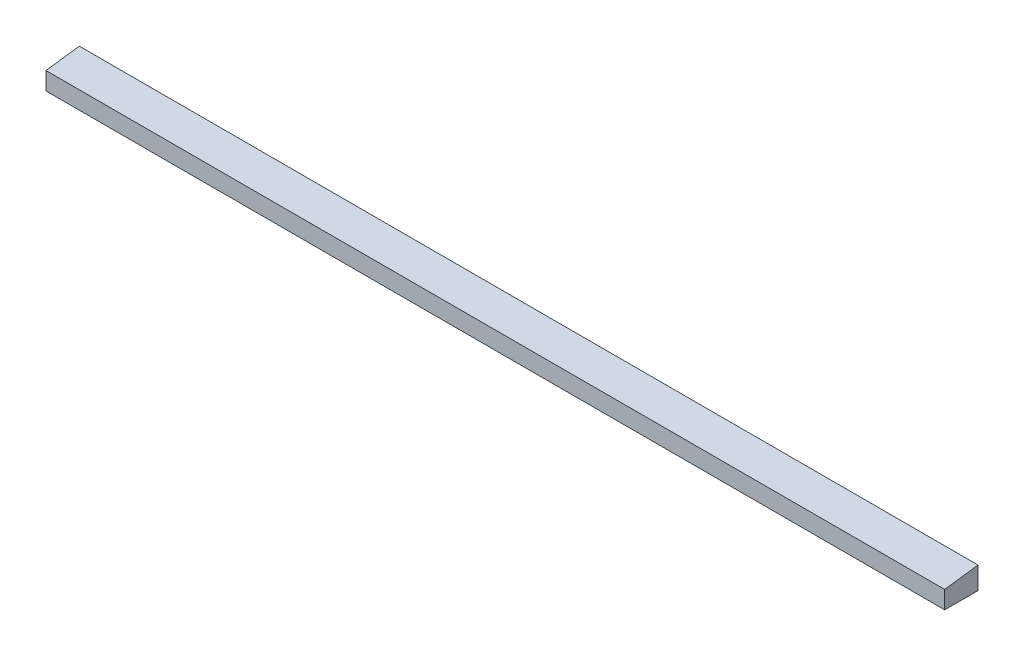
ISO-10303-21;
HEADER;
FILE_DESCRIPTION(('STEP AP214'),'2;1');
FILE_NAME('part.step','',(''),(''),'','','');
FILE_SCHEMA(('AUTOMOTIVE_DESIGN { 1 0 10303 214 1 1 1 1 }'));
ENDSEC;
DATA;
#1=APPLICATION_CONTEXT('core data for automotive mechanical design processes');
#2=APPLICATION_PROTOCOL_DEFINITION('international standard','automotive_design',2000,#1);
#3=PRODUCT_CONTEXT('',#1,'mechanical');
#4=PRODUCT('Part','Part','',(#3));
#5=PRODUCT_RELATED_PRODUCT_CATEGORY('part','',(#4));
#6=PRODUCT_DEFINITION_FORMATION('','',#4);
#7=PRODUCT_DEFINITION_CONTEXT('part definition',#1,'design');
#8=PRODUCT_DEFINITION('design','',#6,#7);
#9=PRODUCT_DEFINITION_SHAPE('','',#8);
#10=(LENGTH_UNIT() NAMED_UNIT(*) SI_UNIT(.MILLI.,.METRE.));
#11=(NAMED_UNIT(*) PLANE_ANGLE_UNIT() SI_UNIT($,.RADIAN.));
#12=(NAMED_UNIT(*) SI_UNIT($,.STERADIAN.) SOLID_ANGLE_UNIT());
#13=UNCERTAINTY_MEASURE_WITH_UNIT(LENGTH_MEASURE(1.E-05),#10,'distance_accuracy_value','');
#14=(GEOMETRIC_REPRESENTATION_CONTEXT(3) GLOBAL_UNCERTAINTY_ASSIGNED_CONTEXT((#13)) GLOBAL_UNIT_ASSIGNED_CONTEXT((#10,
#11,#12)) REPRESENTATION_CONTEXT('',''));
#15=CARTESIAN_POINT('',(0.,0.,0.));
#16=DIRECTION('',(0.,0.,1.));
#17=DIRECTION('',(1.,0.,0.));
#18=AXIS2_PLACEMENT_3D('',#15,#16,#17);
#19=CARTESIAN_POINT('',(0.,0.,19.05));
#20=DIRECTION('',(1.,0.,0.));
#21=DIRECTION('',(0.,0.,-1.));
#22=AXIS2_PLACEMENT_3D('',#19,#20,#21);
#23=PLANE('',#22);
#24=DIRECTION('',(0.,-1.,0.));
#25=VECTOR('',#24,1.);
#26=CARTESIAN_POINT('',(0.,0.,19.05));
#27=LINE('',#26,#25);
#28=CARTESIAN_POINT('',(0.,10.1263128972639,19.05));
#29=VERTEX_POINT('',#28);
#30=CARTESIAN_POINT('',(0.,0.,19.05));
#31=VERTEX_POINT('',#30);
#32=EDGE_CURVE('E99',#29,#31,#27,.T.);
#33=ORIENTED_EDGE('',*,*,#32,.F.);
#34=DIRECTION('',(0.,0.133885341623245,-0.990996829106142));
#35=VECTOR('',#34,1.);
#36=CARTESIAN_POINT('',(0.,9.94479585560327,20.3935586788929));
#37=LINE('',#36,#35);
#38=CARTESIAN_POINT('',(0.,12.7,0.));
#39=VERTEX_POINT('',#38);
#40=EDGE_CURVE('E112',#29,#39,#37,.T.);
#41=ORIENTED_EDGE('',*,*,#40,.T.);
#42=DIRECTION('',(0.,-1.,0.));
#43=VECTOR('',#42,1.);
#44=CARTESIAN_POINT('',(0.,0.,0.));
#45=LINE('',#44,#43);
#46=CARTESIAN_POINT('',(0.,0.,0.));
#47=VERTEX_POINT('',#46);
#48=EDGE_CURVE('E97',#39,#47,#45,.T.);
#49=ORIENTED_EDGE('',*,*,#48,.T.);
#50=DIRECTION('',(0.,0.,-1.));
#51=VECTOR('',#50,1.);
#52=CARTESIAN_POINT('',(0.,0.,19.05));
#53=LINE('',#52,#51);
#54=EDGE_CURVE('E11',#31,#47,#53,.T.);
#55=ORIENTED_EDGE('',*,*,#54,.F.);
#56=EDGE_LOOP('',(#33,#41,#49,#55));
#57=FACE_BOUND('',#56,.T.);
#58=ADVANCED_FACE('F39',(#57),#23,.F.);
#59=CARTESIAN_POINT('',(0.,0.,19.05));
#60=DIRECTION('',(0.,1.,0.));
#61=DIRECTION('',(0.,0.,1.));
#62=AXIS2_PLACEMENT_3D('',#59,#60,#61);
#63=PLANE('',#62);
#64=DIRECTION('',(1.,0.,0.));
#65=VECTOR('',#64,1.);
#66=CARTESIAN_POINT('',(0.,0.,0.));
#67=LINE('',#66,#65);
#68=CARTESIAN_POINT('',(514.35,0.,0.));
#69=VERTEX_POINT('',#68);
#70=EDGE_CURVE('E67',#47,#69,#67,.T.);
#71=ORIENTED_EDGE('',*,*,#70,.T.);
#72=DIRECTION('',(0.,0.,-1.));
#73=VECTOR('',#72,1.);
#74=CARTESIAN_POINT('',(514.35,0.,19.05));
#75=LINE('',#74,#73);
#76=CARTESIAN_POINT('',(514.35,0.,19.05));
#77=VERTEX_POINT('',#76);
#78=EDGE_CURVE('E48',#77,#69,#75,.T.);
#79=ORIENTED_EDGE('',*,*,#78,.F.);
#80=DIRECTION('',(1.,0.,0.));
#81=VECTOR('',#80,1.);
#82=CARTESIAN_POINT('',(0.,0.,19.05));
#83=LINE('',#82,#81);
#84=EDGE_CURVE('E56',#31,#77,#83,.T.);
#85=ORIENTED_EDGE('',*,*,#84,.F.);
#86=ORIENTED_EDGE('',*,*,#54,.T.);
#87=EDGE_LOOP('',(#71,#79,#85,#86));
#88=FACE_BOUND('',#87,.T.);
#89=ADVANCED_FACE('F124',(#88),#63,.F.);
#90=CARTESIAN_POINT('',(514.35,0.,19.05));
#91=DIRECTION('',(-1.,0.,0.));
#92=DIRECTION('',(0.,0.,1.));
#93=AXIS2_PLACEMENT_3D('',#90,#91,#92);
#94=PLANE('',#93);
#95=DIRECTION('',(0.,1.,0.));
#96=VECTOR('',#95,1.);
#97=CARTESIAN_POINT('',(514.35,0.,0.));
#98=LINE('',#97,#96);
#99=CARTESIAN_POINT('',(514.35,12.7,0.));
#100=VERTEX_POINT('',#99);
#101=EDGE_CURVE('E89',#69,#100,#98,.T.);
#102=ORIENTED_EDGE('',*,*,#101,.T.);
#103=DIRECTION('',(0.,0.133885341623245,-0.990996829106142));
#104=VECTOR('',#103,1.);
#105=CARTESIAN_POINT('',(514.35,12.7,0.));
#106=LINE('',#105,#104);
#107=CARTESIAN_POINT('',(514.35,10.1263128972639,19.05));
#108=VERTEX_POINT('',#107);
#109=EDGE_CURVE('E74',#108,#100,#106,.T.);
#110=ORIENTED_EDGE('',*,*,#109,.F.);
#111=DIRECTION('',(0.,1.,0.));
#112=VECTOR('',#111,1.);
#113=CARTESIAN_POINT('',(514.35,0.,19.05));
#114=LINE('',#113,#112);
#115=EDGE_CURVE('E105',#77,#108,#114,.T.);
#116=ORIENTED_EDGE('',*,*,#115,.F.);
#117=ORIENTED_EDGE('',*,*,#78,.T.);
#118=EDGE_LOOP('',(#102,#110,#116,#117));
#119=FACE_BOUND('',#118,.T.);
#120=ADVANCED_FACE('F90',(#119),#94,.F.);
#121=CARTESIAN_POINT('',(0.,0.,19.05));
#122=DIRECTION('',(0.,0.,-1.));
#123=DIRECTION('',(-1.,0.,0.));
#124=AXIS2_PLACEMENT_3D('',#121,#122,#123);
#125=PLANE('',#124);
#126=ORIENTED_EDGE('',*,*,#115,.T.);
#127=DIRECTION('',(1.,0.,0.));
#128=VECTOR('',#127,1.);
#129=CARTESIAN_POINT('',(-221.996,10.1263128972639,19.05));
#130=LINE('',#129,#128);
#131=EDGE_CURVE('E83',#29,#108,#130,.T.);
#132=ORIENTED_EDGE('',*,*,#131,.F.);
#133=ORIENTED_EDGE('',*,*,#32,.T.);
#134=ORIENTED_EDGE('',*,*,#84,.T.);
#135=EDGE_LOOP('',(#126,#132,#133,#134));
#136=FACE_BOUND('',#135,.T.);
#137=ADVANCED_FACE('F123',(#136),#125,.F.);
#138=CARTESIAN_POINT('',(0.,0.,0.));
#139=DIRECTION('',(0.,0.,-1.));
#140=DIRECTION('',(-1.,0.,0.));
#141=AXIS2_PLACEMENT_3D('',#138,#139,#140);
#142=PLANE('',#141);
#143=ORIENTED_EDGE('',*,*,#48,.F.);
#144=DIRECTION('',(-1.,0.,0.));
#145=VECTOR('',#144,1.);
#146=CARTESIAN_POINT('',(0.,12.7,0.));
#147=LINE('',#146,#145);
#148=EDGE_CURVE('E79',#100,#39,#147,.T.);
#149=ORIENTED_EDGE('',*,*,#148,.F.);
#150=ORIENTED_EDGE('',*,*,#101,.F.);
#151=ORIENTED_EDGE('',*,*,#70,.F.);
#152=EDGE_LOOP('',(#143,#149,#150,#151));
#153=FACE_BOUND('',#152,.T.);
#154=ADVANCED_FACE('F95',(#153),#142,.T.);
#155=CARTESIAN_POINT('',(-221.996,12.7,0.));
#156=DIRECTION('',(0.,-0.990996829106142,-0.133885341623245));
#157=DIRECTION('',(0.,0.133885341623245,-0.990996829106142));
#158=AXIS2_PLACEMENT_3D('',#155,#156,#157);
#159=PLANE('',#158);
#160=ORIENTED_EDGE('',*,*,#131,.T.);
#161=ORIENTED_EDGE('',*,*,#109,.T.);
#162=ORIENTED_EDGE('',*,*,#148,.T.);
#163=ORIENTED_EDGE('',*,*,#40,.F.);
#164=EDGE_LOOP('',(#160,#161,#162,#163));
#165=FACE_BOUND('',#164,.T.);
#166=ADVANCED_FACE('F76',(#165),#159,.F.);
#167=CLOSED_SHELL('',(#58,#89,#120,#137,#154,#166));
#168=MANIFOLD_SOLID_BREP('B2',#167);
#169=ADVANCED_BREP_SHAPE_REPRESENTATION('',(#18,#168),#14);
#170=SHAPE_DEFINITION_REPRESENTATION(#9,#169);
ENDSEC;
END-ISO-10303-21;
